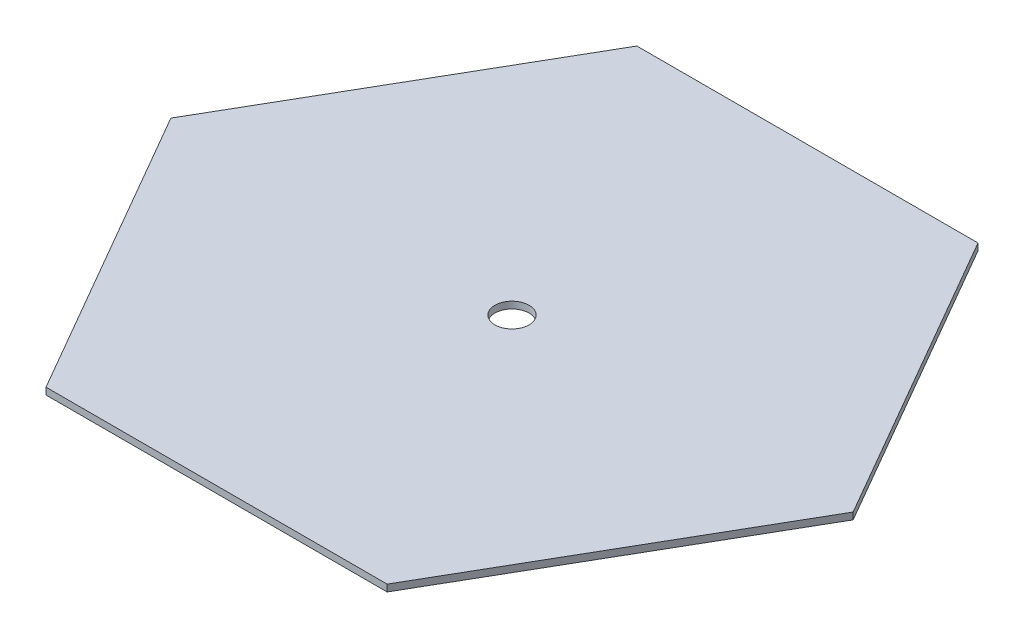
ISO-10303-21;
HEADER;
FILE_DESCRIPTION(('STEP AP214'),'2;1');
FILE_NAME('part.step','',(''),(''),'','','');
FILE_SCHEMA(('AUTOMOTIVE_DESIGN { 1 0 10303 214 1 1 1 1 }'));
ENDSEC;
DATA;
#1=APPLICATION_CONTEXT('core data for automotive mechanical design processes');
#2=APPLICATION_PROTOCOL_DEFINITION('international standard','automotive_design',2000,#1);
#3=PRODUCT_CONTEXT('',#1,'mechanical');
#4=PRODUCT('Part','Part','',(#3));
#5=PRODUCT_RELATED_PRODUCT_CATEGORY('part','',(#4));
#6=PRODUCT_DEFINITION_FORMATION('','',#4);
#7=PRODUCT_DEFINITION_CONTEXT('part definition',#1,'design');
#8=PRODUCT_DEFINITION('design','',#6,#7);
#9=PRODUCT_DEFINITION_SHAPE('','',#8);
#10=(LENGTH_UNIT() NAMED_UNIT(*) SI_UNIT(.MILLI.,.METRE.));
#11=(NAMED_UNIT(*) PLANE_ANGLE_UNIT() SI_UNIT($,.RADIAN.));
#12=(NAMED_UNIT(*) SI_UNIT($,.STERADIAN.) SOLID_ANGLE_UNIT());
#13=UNCERTAINTY_MEASURE_WITH_UNIT(LENGTH_MEASURE(1.E-05),#10,'distance_accuracy_value','');
#14=(GEOMETRIC_REPRESENTATION_CONTEXT(3) GLOBAL_UNCERTAINTY_ASSIGNED_CONTEXT((#13)) GLOBAL_UNIT_ASSIGNED_CONTEXT((#10,
#11,#12)) REPRESENTATION_CONTEXT('',''));
#15=CARTESIAN_POINT('',(0.,0.,0.));
#16=DIRECTION('',(0.,0.,1.));
#17=DIRECTION('',(1.,0.,0.));
#18=AXIS2_PLACEMENT_3D('',#15,#16,#17);
#19=CARTESIAN_POINT('',(250.000000000005,10.,433.012701892216));
#20=DIRECTION('',(-0.866025403784442,0.,-0.499999999999995));
#21=DIRECTION('',(-0.499999999999995,0.,0.866025403784442));
#22=AXIS2_PLACEMENT_3D('',#19,#20,#21);
#23=PLANE('',#22);
#24=DIRECTION('',(0.499999999999995,0.,-0.866025403784442));
#25=VECTOR('',#24,1.);
#26=CARTESIAN_POINT('',(250.000000000005,0.,433.012701892216));
#27=LINE('',#26,#25);
#28=CARTESIAN_POINT('',(250.000000000005,0.,433.012701892216));
#29=VERTEX_POINT('',#28);
#30=CARTESIAN_POINT('',(499.999999999999,0.,0.));
#31=VERTEX_POINT('',#30);
#32=EDGE_CURVE('E116',#29,#31,#27,.T.);
#33=ORIENTED_EDGE('',*,*,#32,.T.);
#34=DIRECTION('',(0.,-1.,0.));
#35=VECTOR('',#34,1.);
#36=CARTESIAN_POINT('',(499.999999999999,10.,0.));
#37=LINE('',#36,#35);
#38=CARTESIAN_POINT('',(499.999999999999,10.,0.));
#39=VERTEX_POINT('',#38);
#40=EDGE_CURVE('E11',#39,#31,#37,.T.);
#41=ORIENTED_EDGE('',*,*,#40,.F.);
#42=DIRECTION('',(0.499999999999995,0.,-0.866025403784442));
#43=VECTOR('',#42,1.);
#44=CARTESIAN_POINT('',(250.000000000005,10.,433.012701892216));
#45=LINE('',#44,#43);
#46=CARTESIAN_POINT('',(250.000000000005,10.,433.012701892216));
#47=VERTEX_POINT('',#46);
#48=EDGE_CURVE('E127',#47,#39,#45,.T.);
#49=ORIENTED_EDGE('',*,*,#48,.F.);
#50=DIRECTION('',(0.,-1.,0.));
#51=VECTOR('',#50,1.);
#52=CARTESIAN_POINT('',(250.000000000005,10.,433.012701892216));
#53=LINE('',#52,#51);
#54=EDGE_CURVE('E112',#47,#29,#53,.T.);
#55=ORIENTED_EDGE('',*,*,#54,.T.);
#56=EDGE_LOOP('',(#33,#41,#49,#55));
#57=FACE_BOUND('',#56,.T.);
#58=ADVANCED_FACE('F32',(#57),#23,.F.);
#59=CARTESIAN_POINT('',(499.999999999999,10.,0.));
#60=DIRECTION('',(-0.866025403784438,0.,0.500000000000001));
#61=DIRECTION('',(0.500000000000001,0.,0.866025403784438));
#62=AXIS2_PLACEMENT_3D('',#59,#60,#61);
#63=PLANE('',#62);
#64=DIRECTION('',(-0.500000000000001,0.,-0.866025403784438));
#65=VECTOR('',#64,1.);
#66=CARTESIAN_POINT('',(499.999999999999,0.,0.));
#67=LINE('',#66,#65);
#68=CARTESIAN_POINT('',(249.999999999999,0.,-433.012701892219));
#69=VERTEX_POINT('',#68);
#70=EDGE_CURVE('E119',#31,#69,#67,.T.);
#71=ORIENTED_EDGE('',*,*,#70,.T.);
#72=DIRECTION('',(0.,-1.,0.));
#73=VECTOR('',#72,1.);
#74=CARTESIAN_POINT('',(249.999999999999,10.,-433.012701892219));
#75=LINE('',#74,#73);
#76=CARTESIAN_POINT('',(249.999999999999,10.,-433.012701892219));
#77=VERTEX_POINT('',#76);
#78=EDGE_CURVE('E40',#77,#69,#75,.T.);
#79=ORIENTED_EDGE('',*,*,#78,.F.);
#80=DIRECTION('',(-0.500000000000001,0.,-0.866025403784438));
#81=VECTOR('',#80,1.);
#82=CARTESIAN_POINT('',(499.999999999999,10.,0.));
#83=LINE('',#82,#81);
#84=EDGE_CURVE('E85',#39,#77,#83,.T.);
#85=ORIENTED_EDGE('',*,*,#84,.F.);
#86=ORIENTED_EDGE('',*,*,#40,.T.);
#87=EDGE_LOOP('',(#71,#79,#85,#86));
#88=FACE_BOUND('',#87,.T.);
#89=ADVANCED_FACE('F152',(#88),#63,.F.);
#90=CARTESIAN_POINT('',(249.999999999999,10.,-433.012701892219));
#91=DIRECTION('',(0.,0.,1.));
#92=DIRECTION('',(1.,0.,0.));
#93=AXIS2_PLACEMENT_3D('',#90,#91,#92);
#94=PLANE('',#93);
#95=DIRECTION('',(-1.,0.,0.));
#96=VECTOR('',#95,1.);
#97=CARTESIAN_POINT('',(249.999999999999,0.,-433.012701892219));
#98=LINE('',#97,#96);
#99=CARTESIAN_POINT('',(-250.000000000002,0.,-433.012701892217));
#100=VERTEX_POINT('',#99);
#101=EDGE_CURVE('E122',#69,#100,#98,.T.);
#102=ORIENTED_EDGE('',*,*,#101,.T.);
#103=DIRECTION('',(0.,-1.,0.));
#104=VECTOR('',#103,1.);
#105=CARTESIAN_POINT('',(-250.000000000002,10.,-433.012701892217));
#106=LINE('',#105,#104);
#107=CARTESIAN_POINT('',(-250.000000000002,10.,-433.012701892217));
#108=VERTEX_POINT('',#107);
#109=EDGE_CURVE('E107',#108,#100,#106,.T.);
#110=ORIENTED_EDGE('',*,*,#109,.F.);
#111=DIRECTION('',(-1.,0.,0.));
#112=VECTOR('',#111,1.);
#113=CARTESIAN_POINT('',(249.999999999999,10.,-433.012701892219));
#114=LINE('',#113,#112);
#115=EDGE_CURVE('E98',#77,#108,#114,.T.);
#116=ORIENTED_EDGE('',*,*,#115,.F.);
#117=ORIENTED_EDGE('',*,*,#78,.T.);
#118=EDGE_LOOP('',(#102,#110,#116,#117));
#119=FACE_BOUND('',#118,.T.);
#120=ADVANCED_FACE('F133',(#119),#94,.F.);
#121=CARTESIAN_POINT('',(-250.000000000002,10.,-433.012701892217));
#122=DIRECTION('',(0.866025403784442,0.,0.499999999999995));
#123=DIRECTION('',(0.499999999999995,0.,-0.866025403784442));
#124=AXIS2_PLACEMENT_3D('',#121,#122,#123);
#125=PLANE('',#124);
#126=DIRECTION('',(-0.499999999999995,0.,0.866025403784442));
#127=VECTOR('',#126,1.);
#128=CARTESIAN_POINT('',(-250.000000000002,0.,-433.012701892217));
#129=LINE('',#128,#127);
#130=CARTESIAN_POINT('',(-499.999999999999,0.,3.49148133884313E-12));
#131=VERTEX_POINT('',#130);
#132=EDGE_CURVE('E106',#100,#131,#129,.T.);
#133=ORIENTED_EDGE('',*,*,#132,.T.);
#134=DIRECTION('',(0.,-1.,0.));
#135=VECTOR('',#134,1.);
#136=CARTESIAN_POINT('',(-499.999999999999,10.,3.49148133884313E-12));
#137=LINE('',#136,#135);
#138=CARTESIAN_POINT('',(-499.999999999999,10.,3.49148133884313E-12));
#139=VERTEX_POINT('',#138);
#140=EDGE_CURVE('E103',#139,#131,#137,.T.);
#141=ORIENTED_EDGE('',*,*,#140,.F.);
#142=DIRECTION('',(-0.499999999999995,0.,0.866025403784442));
#143=VECTOR('',#142,1.);
#144=CARTESIAN_POINT('',(-250.000000000002,10.,-433.012701892217));
#145=LINE('',#144,#143);
#146=EDGE_CURVE('E92',#108,#139,#145,.T.);
#147=ORIENTED_EDGE('',*,*,#146,.F.);
#148=ORIENTED_EDGE('',*,*,#109,.T.);
#149=EDGE_LOOP('',(#133,#141,#147,#148));
#150=FACE_BOUND('',#149,.T.);
#151=ADVANCED_FACE('F104',(#150),#125,.F.);
#152=CARTESIAN_POINT('',(-499.999999999999,10.,3.49148133884313E-12));
#153=DIRECTION('',(0.866025403784435,0.,-0.500000000000007));
#154=DIRECTION('',(-0.500000000000007,0.,-0.866025403784435));
#155=AXIS2_PLACEMENT_3D('',#152,#153,#154);
#156=PLANE('',#155);
#157=DIRECTION('',(0.500000000000007,0.,0.866025403784435));
#158=VECTOR('',#157,1.);
#159=CARTESIAN_POINT('',(-499.999999999999,0.,3.49148133884313E-12));
#160=LINE('',#159,#158);
#161=CARTESIAN_POINT('',(-249.999999999996,0.,433.012701892221));
#162=VERTEX_POINT('',#161);
#163=EDGE_CURVE('E71',#131,#162,#160,.T.);
#164=ORIENTED_EDGE('',*,*,#163,.T.);
#165=DIRECTION('',(0.,-1.,0.));
#166=VECTOR('',#165,1.);
#167=CARTESIAN_POINT('',(-249.999999999996,10.,433.012701892221));
#168=LINE('',#167,#166);
#169=CARTESIAN_POINT('',(-249.999999999996,10.,433.012701892221));
#170=VERTEX_POINT('',#169);
#171=EDGE_CURVE('E108',#170,#162,#168,.T.);
#172=ORIENTED_EDGE('',*,*,#171,.F.);
#173=DIRECTION('',(0.500000000000007,0.,0.866025403784435));
#174=VECTOR('',#173,1.);
#175=CARTESIAN_POINT('',(-499.999999999999,10.,3.49148133884313E-12));
#176=LINE('',#175,#174);
#177=EDGE_CURVE('E96',#139,#170,#176,.T.);
#178=ORIENTED_EDGE('',*,*,#177,.F.);
#179=ORIENTED_EDGE('',*,*,#140,.T.);
#180=EDGE_LOOP('',(#164,#172,#178,#179));
#181=FACE_BOUND('',#180,.T.);
#182=ADVANCED_FACE('F110',(#181),#156,.F.);
#183=CARTESIAN_POINT('',(-249.999999999996,10.,433.012701892221));
#184=DIRECTION('',(0.,0.,-1.));
#185=DIRECTION('',(-1.,0.,0.));
#186=AXIS2_PLACEMENT_3D('',#183,#184,#185);
#187=PLANE('',#186);
#188=DIRECTION('',(1.,0.,0.));
#189=VECTOR('',#188,1.);
#190=CARTESIAN_POINT('',(-249.999999999996,0.,433.012701892221));
#191=LINE('',#190,#189);
#192=EDGE_CURVE('E77',#162,#29,#191,.T.);
#193=ORIENTED_EDGE('',*,*,#192,.T.);
#194=ORIENTED_EDGE('',*,*,#54,.F.);
#195=DIRECTION('',(1.,0.,0.));
#196=VECTOR('',#195,1.);
#197=CARTESIAN_POINT('',(-249.999999999996,10.,433.012701892221));
#198=LINE('',#197,#196);
#199=EDGE_CURVE('E48',#170,#47,#198,.T.);
#200=ORIENTED_EDGE('',*,*,#199,.F.);
#201=ORIENTED_EDGE('',*,*,#171,.T.);
#202=EDGE_LOOP('',(#193,#194,#200,#201));
#203=FACE_BOUND('',#202,.T.);
#204=ADVANCED_FACE('F140',(#203),#187,.F.);
#205=CARTESIAN_POINT('',(0.,10.,0.));
#206=DIRECTION('',(0.,1.,0.));
#207=DIRECTION('',(0.,0.,1.));
#208=AXIS2_PLACEMENT_3D('',#205,#206,#207);
#209=PLANE('',#208);
#210=CARTESIAN_POINT('',(0.,10.,0.));
#211=DIRECTION('',(0.,-1.,0.));
#212=DIRECTION('',(0.,0.,-1.));
#213=AXIS2_PLACEMENT_3D('',#210,#211,#212);
#214=CIRCLE('',#213,25.);
#215=CARTESIAN_POINT('',(0.,10.,-25.));
#216=VERTEX_POINT('',#215);
#217=EDGE_CURVE('E120',#216,#216,#214,.T.);
#218=ORIENTED_EDGE('',*,*,#217,.T.);
#219=EDGE_LOOP('',(#218));
#220=FACE_BOUND('',#219,.T.);
#221=ORIENTED_EDGE('',*,*,#48,.T.);
#222=ORIENTED_EDGE('',*,*,#84,.T.);
#223=ORIENTED_EDGE('',*,*,#115,.T.);
#224=ORIENTED_EDGE('',*,*,#146,.T.);
#225=ORIENTED_EDGE('',*,*,#177,.T.);
#226=ORIENTED_EDGE('',*,*,#199,.T.);
#227=EDGE_LOOP('',(#221,#222,#223,#224,#225,#226));
#228=FACE_BOUND('',#227,.T.);
#229=ADVANCED_FACE('F94',(#220,#228),#209,.T.);
#230=CARTESIAN_POINT('',(0.,0.,0.));
#231=DIRECTION('',(0.,1.,0.));
#232=DIRECTION('',(0.,0.,1.));
#233=AXIS2_PLACEMENT_3D('',#230,#231,#232);
#234=PLANE('',#233);
#235=CARTESIAN_POINT('',(0.,0.,0.));
#236=DIRECTION('',(0.,-1.,0.));
#237=DIRECTION('',(0.,0.,-1.));
#238=AXIS2_PLACEMENT_3D('',#235,#236,#237);
#239=CIRCLE('',#238,25.);
#240=CARTESIAN_POINT('',(0.,0.,-25.));
#241=VERTEX_POINT('',#240);
#242=EDGE_CURVE('E207',#241,#241,#239,.T.);
#243=ORIENTED_EDGE('',*,*,#242,.F.);
#244=EDGE_LOOP('',(#243));
#245=FACE_BOUND('',#244,.T.);
#246=ORIENTED_EDGE('',*,*,#32,.F.);
#247=ORIENTED_EDGE('',*,*,#192,.F.);
#248=ORIENTED_EDGE('',*,*,#163,.F.);
#249=ORIENTED_EDGE('',*,*,#132,.F.);
#250=ORIENTED_EDGE('',*,*,#101,.F.);
#251=ORIENTED_EDGE('',*,*,#70,.F.);
#252=EDGE_LOOP('',(#246,#247,#248,#249,#250,#251));
#253=FACE_BOUND('',#252,.T.);
#254=ADVANCED_FACE('F136',(#245,#253),#234,.F.);
#255=CARTESIAN_POINT('',(0.,10.,0.));
#256=DIRECTION('',(0.,-1.,0.));
#257=DIRECTION('',(0.,0.,-1.));
#258=AXIS2_PLACEMENT_3D('',#255,#256,#257);
#259=CYLINDRICAL_SURFACE('',#258,25.);
#260=ORIENTED_EDGE('',*,*,#217,.F.);
#261=EDGE_LOOP('',(#260));
#262=FACE_BOUND('',#261,.T.);
#263=ORIENTED_EDGE('',*,*,#242,.T.);
#264=EDGE_LOOP('',(#263));
#265=FACE_BOUND('',#264,.T.);
#266=ADVANCED_FACE('F189',(#262,#265),#259,.F.);
#267=CLOSED_SHELL('',(#58,#89,#120,#151,#182,#204,#229,#254,#266));
#268=MANIFOLD_SOLID_BREP('B2',#267);
#269=ADVANCED_BREP_SHAPE_REPRESENTATION('',(#18,#268),#14);
#270=SHAPE_DEFINITION_REPRESENTATION(#9,#269);
ENDSEC;
END-ISO-10303-21;
